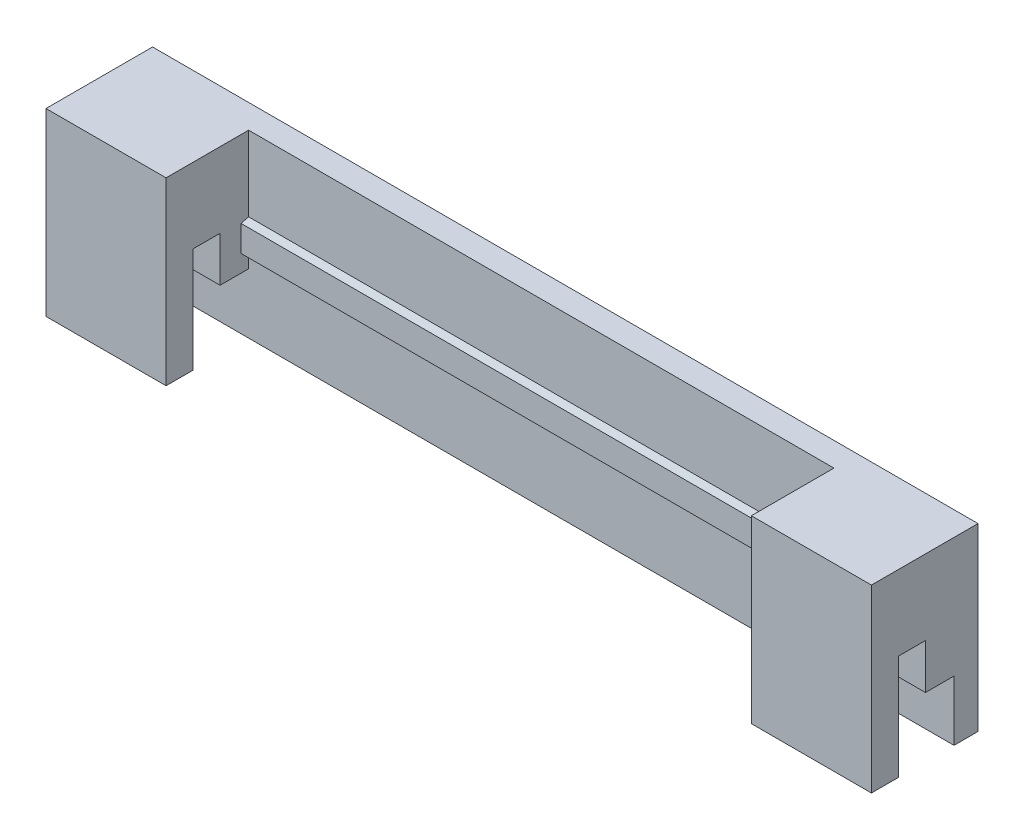
ISO-10303-21;
HEADER;
FILE_DESCRIPTION(('STEP AP214'),'2;1');
FILE_NAME('part.step','',(''),(''),'','','');
FILE_SCHEMA(('AUTOMOTIVE_DESIGN { 1 0 10303 214 1 1 1 1 }'));
ENDSEC;
DATA;
#1=APPLICATION_CONTEXT('core data for automotive mechanical design processes');
#2=APPLICATION_PROTOCOL_DEFINITION('international standard','automotive_design',2000,#1);
#3=PRODUCT_CONTEXT('',#1,'mechanical');
#4=PRODUCT('Part','Part','',(#3));
#5=PRODUCT_RELATED_PRODUCT_CATEGORY('part','',(#4));
#6=PRODUCT_DEFINITION_FORMATION('','',#4);
#7=PRODUCT_DEFINITION_CONTEXT('part definition',#1,'design');
#8=PRODUCT_DEFINITION('design','',#6,#7);
#9=PRODUCT_DEFINITION_SHAPE('','',#8);
#10=(LENGTH_UNIT() NAMED_UNIT(*) SI_UNIT(.MILLI.,.METRE.));
#11=(NAMED_UNIT(*) PLANE_ANGLE_UNIT() SI_UNIT($,.RADIAN.));
#12=(NAMED_UNIT(*) SI_UNIT($,.STERADIAN.) SOLID_ANGLE_UNIT());
#13=UNCERTAINTY_MEASURE_WITH_UNIT(LENGTH_MEASURE(1.E-05),#10,'distance_accuracy_value','');
#14=(GEOMETRIC_REPRESENTATION_CONTEXT(3) GLOBAL_UNCERTAINTY_ASSIGNED_CONTEXT((#13)) GLOBAL_UNIT_ASSIGNED_CONTEXT((#10,
#11,#12)) REPRESENTATION_CONTEXT('',''));
#15=CARTESIAN_POINT('',(0.,0.,0.));
#16=DIRECTION('',(0.,0.,1.));
#17=DIRECTION('',(1.,0.,0.));
#18=AXIS2_PLACEMENT_3D('',#15,#16,#17);
#19=CARTESIAN_POINT('',(0.,0.,1.6));
#20=DIRECTION('',(0.,0.,-1.));
#21=DIRECTION('',(-1.,0.,0.));
#22=AXIS2_PLACEMENT_3D('',#19,#20,#21);
#23=PLANE('',#22);
#24=DIRECTION('',(1.,0.,0.));
#25=VECTOR('',#24,1.);
#26=CARTESIAN_POINT('',(-27.5,-1.,1.6));
#27=LINE('',#26,#25);
#28=CARTESIAN_POINT('',(-19.5,-1.,1.6));
#29=VERTEX_POINT('',#28);
#30=CARTESIAN_POINT('',(19.5,-1.,1.6));
#31=VERTEX_POINT('',#30);
#32=EDGE_CURVE('E208',#29,#31,#27,.T.);
#33=ORIENTED_EDGE('',*,*,#32,.F.);
#34=DIRECTION('',(0.,1.,0.));
#35=VECTOR('',#34,1.);
#36=CARTESIAN_POINT('',(-19.5,6.,1.6));
#37=LINE('',#36,#35);
#38=CARTESIAN_POINT('',(-19.5,-2.,1.6));
#39=VERTEX_POINT('',#38);
#40=EDGE_CURVE('E243',#39,#29,#37,.T.);
#41=ORIENTED_EDGE('',*,*,#40,.F.);
#42=DIRECTION('',(1.,0.,0.));
#43=VECTOR('',#42,1.);
#44=CARTESIAN_POINT('',(-27.5,-2.,1.6));
#45=LINE('',#44,#43);
#46=CARTESIAN_POINT('',(-27.5,-2.,1.6));
#47=VERTEX_POINT('',#46);
#48=EDGE_CURVE('E238',#47,#39,#45,.T.);
#49=ORIENTED_EDGE('',*,*,#48,.F.);
#50=DIRECTION('',(0.,-1.,0.));
#51=VECTOR('',#50,1.);
#52=CARTESIAN_POINT('',(-27.5,6.,1.6));
#53=LINE('',#52,#51);
#54=CARTESIAN_POINT('',(-27.5,-6.00000000000001,1.6));
#55=VERTEX_POINT('',#54);
#56=EDGE_CURVE('E268',#47,#55,#53,.T.);
#57=ORIENTED_EDGE('',*,*,#56,.T.);
#58=DIRECTION('',(1.,0.,0.));
#59=VECTOR('',#58,1.);
#60=CARTESIAN_POINT('',(27.5,-6.,1.6));
#61=LINE('',#60,#59);
#62=CARTESIAN_POINT('',(27.5,-6.,1.6));
#63=VERTEX_POINT('',#62);
#64=EDGE_CURVE('E271',#55,#63,#61,.T.);
#65=ORIENTED_EDGE('',*,*,#64,.T.);
#66=DIRECTION('',(0.,1.,0.));
#67=VECTOR('',#66,1.);
#68=CARTESIAN_POINT('',(27.5,6.,1.6));
#69=LINE('',#68,#67);
#70=CARTESIAN_POINT('',(27.5,-2.,1.6));
#71=VERTEX_POINT('',#70);
#72=EDGE_CURVE('E275',#63,#71,#69,.T.);
#73=ORIENTED_EDGE('',*,*,#72,.T.);
#74=DIRECTION('',(1.,0.,0.));
#75=VECTOR('',#74,1.);
#76=CARTESIAN_POINT('',(27.5,-2.,1.6));
#77=LINE('',#76,#75);
#78=CARTESIAN_POINT('',(19.5,-2.,1.6));
#79=VERTEX_POINT('',#78);
#80=EDGE_CURVE('E215',#79,#71,#77,.T.);
#81=ORIENTED_EDGE('',*,*,#80,.F.);
#82=DIRECTION('',(0.,-1.,0.));
#83=VECTOR('',#82,1.);
#84=CARTESIAN_POINT('',(19.5,6.,1.6));
#85=LINE('',#84,#83);
#86=EDGE_CURVE('E216',#31,#79,#85,.T.);
#87=ORIENTED_EDGE('',*,*,#86,.F.);
#88=EDGE_LOOP('',(#33,#41,#49,#57,#65,#73,#81,#87));
#89=FACE_BOUND('',#88,.T.);
#90=ADVANCED_FACE('F39',(#89),#23,.F.);
#91=DIRECTION('',(-1.,0.,0.));
#92=VECTOR('',#91,1.);
#93=CARTESIAN_POINT('',(-27.5,0.999999999999996,1.6));
#94=LINE('',#93,#92);
#95=CARTESIAN_POINT('',(19.5,0.999999999999996,1.6));
#96=VERTEX_POINT('',#95);
#97=CARTESIAN_POINT('',(-19.5,0.999999999999996,1.6));
#98=VERTEX_POINT('',#97);
#99=EDGE_CURVE('E190',#96,#98,#94,.T.);
#100=ORIENTED_EDGE('',*,*,#99,.F.);
#101=CARTESIAN_POINT('',(19.5,6.,1.6));
#102=VERTEX_POINT('',#101);
#103=EDGE_CURVE('E204',#102,#96,#85,.T.);
#104=ORIENTED_EDGE('',*,*,#103,.F.);
#105=DIRECTION('',(-1.,0.,0.));
#106=VECTOR('',#105,1.);
#107=CARTESIAN_POINT('',(27.5,6.,1.6));
#108=LINE('',#107,#106);
#109=CARTESIAN_POINT('',(-19.5,6.,1.6));
#110=VERTEX_POINT('',#109);
#111=EDGE_CURVE('E278',#102,#110,#108,.T.);
#112=ORIENTED_EDGE('',*,*,#111,.T.);
#113=EDGE_CURVE('E206',#98,#110,#37,.T.);
#114=ORIENTED_EDGE('',*,*,#113,.F.);
#115=EDGE_LOOP('',(#100,#104,#112,#114));
#116=FACE_BOUND('',#115,.T.);
#117=ADVANCED_FACE('F202',(#116),#23,.F.);
#118=CARTESIAN_POINT('',(-19.5,6.,3.5));
#119=DIRECTION('',(-1.,0.,0.));
#120=DIRECTION('',(0.,0.,1.));
#121=AXIS2_PLACEMENT_3D('',#118,#119,#120);
#122=PLANE('',#121);
#123=DIRECTION('',(0.,0.258819045102521,0.965925826289068));
#124=VECTOR('',#123,1.);
#125=CARTESIAN_POINT('',(-19.5,-0.0560889132455358,5.12272413359522));
#126=LINE('',#125,#124);
#127=CARTESIAN_POINT('',(-19.5,-0.866025403784443,2.1));
#128=VERTEX_POINT('',#127);
#129=EDGE_CURVE('E319',#128,#29,#126,.F.);
#130=ORIENTED_EDGE('',*,*,#129,.F.);
#131=DIRECTION('',(0.,1.,0.));
#132=VECTOR('',#131,1.);
#133=CARTESIAN_POINT('',(-19.5,6.,2.1));
#134=LINE('',#133,#132);
#135=CARTESIAN_POINT('',(-19.5,0.866025403784434,2.1));
#136=VERTEX_POINT('',#135);
#137=EDGE_CURVE('E312',#128,#136,#134,.T.);
#138=ORIENTED_EDGE('',*,*,#137,.T.);
#139=DIRECTION('',(0.,0.258819045102521,-0.965925826289068));
#140=VECTOR('',#139,1.);
#141=CARTESIAN_POINT('',(-19.5,0.8599364905389,2.12272413359521));
#142=LINE('',#141,#140);
#143=EDGE_CURVE('E318',#98,#136,#142,.F.);
#144=ORIENTED_EDGE('',*,*,#143,.F.);
#145=ORIENTED_EDGE('',*,*,#113,.T.);
#146=DIRECTION('',(0.,0.,-1.));
#147=VECTOR('',#146,1.);
#148=CARTESIAN_POINT('',(-19.5,6.,3.5));
#149=LINE('',#148,#147);
#150=CARTESIAN_POINT('',(-19.5,6.,7.1));
#151=VERTEX_POINT('',#150);
#152=EDGE_CURVE('E249',#151,#110,#149,.T.);
#153=ORIENTED_EDGE('',*,*,#152,.F.);
#154=DIRECTION('',(0.,1.,0.));
#155=VECTOR('',#154,1.);
#156=CARTESIAN_POINT('',(-19.5,6.,7.1));
#157=LINE('',#156,#155);
#158=CARTESIAN_POINT('',(-19.5,-6.00000000000001,7.1));
#159=VERTEX_POINT('',#158);
#160=EDGE_CURVE('E369',#159,#151,#157,.T.);
#161=ORIENTED_EDGE('',*,*,#160,.F.);
#162=DIRECTION('',(0.,0.,-1.));
#163=VECTOR('',#162,1.);
#164=CARTESIAN_POINT('',(-19.5,-6.00000000000001,7.1));
#165=LINE('',#164,#163);
#166=CARTESIAN_POINT('',(-19.5,-6.00000000000001,5.3));
#167=VERTEX_POINT('',#166);
#168=EDGE_CURVE('E377',#159,#167,#165,.T.);
#169=ORIENTED_EDGE('',*,*,#168,.T.);
#170=DIRECTION('',(0.,1.,0.));
#171=VECTOR('',#170,1.);
#172=CARTESIAN_POINT('',(-19.5,6.,5.3));
#173=LINE('',#172,#171);
#174=CARTESIAN_POINT('',(-19.5,0.999999999999997,5.3));
#175=VERTEX_POINT('',#174);
#176=EDGE_CURVE('E366',#167,#175,#173,.T.);
#177=ORIENTED_EDGE('',*,*,#176,.T.);
#178=DIRECTION('',(0.,0.,-1.));
#179=VECTOR('',#178,1.);
#180=CARTESIAN_POINT('',(-19.5,0.999999999999997,5.3));
#181=LINE('',#180,#179);
#182=CARTESIAN_POINT('',(-19.5,0.999999999999997,3.5));
#183=VERTEX_POINT('',#182);
#184=EDGE_CURVE('E412',#175,#183,#181,.T.);
#185=ORIENTED_EDGE('',*,*,#184,.T.);
#186=DIRECTION('',(0.,1.,0.));
#187=VECTOR('',#186,1.);
#188=CARTESIAN_POINT('',(-19.5,6.,3.5));
#189=LINE('',#188,#187);
#190=CARTESIAN_POINT('',(-19.5,-2.,3.5));
#191=VERTEX_POINT('',#190);
#192=EDGE_CURVE('E246',#191,#183,#189,.T.);
#193=ORIENTED_EDGE('',*,*,#192,.F.);
#194=DIRECTION('',(0.,0.,-1.));
#195=VECTOR('',#194,1.);
#196=CARTESIAN_POINT('',(-19.5,-2.,3.5));
#197=LINE('',#196,#195);
#198=EDGE_CURVE('E259',#191,#39,#197,.T.);
#199=ORIENTED_EDGE('',*,*,#198,.T.);
#200=ORIENTED_EDGE('',*,*,#40,.T.);
#201=EDGE_LOOP('',(#130,#138,#144,#145,#153,#161,#169,#177,#185,#193,#199,#200));
#202=FACE_BOUND('',#201,.T.);
#203=ADVANCED_FACE('F317',(#202),#122,.F.);
#204=CARTESIAN_POINT('',(19.5,6.,3.5));
#205=DIRECTION('',(1.,0.,0.));
#206=DIRECTION('',(0.,0.,-1.));
#207=AXIS2_PLACEMENT_3D('',#204,#205,#206);
#208=PLANE('',#207);
#209=DIRECTION('',(0.,-0.258819045102521,-0.965925826289068));
#210=VECTOR('',#209,1.);
#211=CARTESIAN_POINT('',(19.5,-0.0560889132455358,5.12272413359522));
#212=LINE('',#211,#210);
#213=CARTESIAN_POINT('',(19.5,-0.866025403784443,2.1));
#214=VERTEX_POINT('',#213);
#215=EDGE_CURVE('E11',#31,#214,#212,.F.);
#216=ORIENTED_EDGE('',*,*,#215,.F.);
#217=ORIENTED_EDGE('',*,*,#86,.T.);
#218=DIRECTION('',(0.,0.,-1.));
#219=VECTOR('',#218,1.);
#220=CARTESIAN_POINT('',(19.5,-2.,3.5));
#221=LINE('',#220,#219);
#222=CARTESIAN_POINT('',(19.5,-2.,3.5));
#223=VERTEX_POINT('',#222);
#224=EDGE_CURVE('E232',#223,#79,#221,.T.);
#225=ORIENTED_EDGE('',*,*,#224,.F.);
#226=DIRECTION('',(0.,-1.,0.));
#227=VECTOR('',#226,1.);
#228=CARTESIAN_POINT('',(19.5,6.,3.5));
#229=LINE('',#228,#227);
#230=CARTESIAN_POINT('',(19.5,0.999999999999997,3.5));
#231=VERTEX_POINT('',#230);
#232=EDGE_CURVE('E423',#231,#223,#229,.T.);
#233=ORIENTED_EDGE('',*,*,#232,.F.);
#234=DIRECTION('',(0.,0.,-1.));
#235=VECTOR('',#234,1.);
#236=CARTESIAN_POINT('',(19.5,0.999999999999997,5.3));
#237=LINE('',#236,#235);
#238=CARTESIAN_POINT('',(19.5,0.999999999999998,5.3));
#239=VERTEX_POINT('',#238);
#240=EDGE_CURVE('E403',#239,#231,#237,.T.);
#241=ORIENTED_EDGE('',*,*,#240,.F.);
#242=DIRECTION('',(0.,-1.,0.));
#243=VECTOR('',#242,1.);
#244=CARTESIAN_POINT('',(19.5,6.,5.3));
#245=LINE('',#244,#243);
#246=CARTESIAN_POINT('',(19.5,-6.00000000000001,5.3));
#247=VERTEX_POINT('',#246);
#248=EDGE_CURVE('E348',#239,#247,#245,.T.);
#249=ORIENTED_EDGE('',*,*,#248,.T.);
#250=DIRECTION('',(0.,0.,-1.));
#251=VECTOR('',#250,1.);
#252=CARTESIAN_POINT('',(19.5,-6.00000000000001,7.1));
#253=LINE('',#252,#251);
#254=CARTESIAN_POINT('',(19.5,-6.00000000000001,7.1));
#255=VERTEX_POINT('',#254);
#256=EDGE_CURVE('E356',#255,#247,#253,.T.);
#257=ORIENTED_EDGE('',*,*,#256,.F.);
#258=DIRECTION('',(0.,-1.,0.));
#259=VECTOR('',#258,1.);
#260=CARTESIAN_POINT('',(19.5,6.,7.1));
#261=LINE('',#260,#259);
#262=CARTESIAN_POINT('',(19.5,6.,7.1));
#263=VERTEX_POINT('',#262);
#264=EDGE_CURVE('E338',#263,#255,#261,.T.);
#265=ORIENTED_EDGE('',*,*,#264,.F.);
#266=DIRECTION('',(0.,0.,-1.));
#267=VECTOR('',#266,1.);
#268=CARTESIAN_POINT('',(19.5,6.,3.5));
#269=LINE('',#268,#267);
#270=EDGE_CURVE('E213',#263,#102,#269,.T.);
#271=ORIENTED_EDGE('',*,*,#270,.T.);
#272=ORIENTED_EDGE('',*,*,#103,.T.);
#273=DIRECTION('',(0.,-0.258819045102521,0.965925826289068));
#274=VECTOR('',#273,1.);
#275=CARTESIAN_POINT('',(19.5,0.8599364905389,2.12272413359521));
#276=LINE('',#275,#274);
#277=CARTESIAN_POINT('',(19.5,0.866025403784434,2.1));
#278=VERTEX_POINT('',#277);
#279=EDGE_CURVE('E48',#278,#96,#276,.F.);
#280=ORIENTED_EDGE('',*,*,#279,.F.);
#281=DIRECTION('',(0.,-1.,0.));
#282=VECTOR('',#281,1.);
#283=CARTESIAN_POINT('',(19.5,6.,2.1));
#284=LINE('',#283,#282);
#285=EDGE_CURVE('E198',#278,#214,#284,.T.);
#286=ORIENTED_EDGE('',*,*,#285,.T.);
#287=EDGE_LOOP('',(#216,#217,#225,#233,#241,#249,#257,#265,#271,#272,#280,#286));
#288=FACE_BOUND('',#287,.T.);
#289=ADVANCED_FACE('F211',(#288),#208,.F.);
#290=CARTESIAN_POINT('',(0.,0.,3.5));
#291=DIRECTION('',(0.,0.,-1.));
#292=DIRECTION('',(-1.,0.,0.));
#293=AXIS2_PLACEMENT_3D('',#290,#291,#292);
#294=PLANE('',#293);
#295=DIRECTION('',(1.,0.,0.));
#296=VECTOR('',#295,1.);
#297=CARTESIAN_POINT('',(19.5,0.999999999999997,3.5));
#298=LINE('',#297,#296);
#299=CARTESIAN_POINT('',(27.5,0.999999999999997,3.5));
#300=VERTEX_POINT('',#299);
#301=EDGE_CURVE('E62',#231,#300,#298,.T.);
#302=ORIENTED_EDGE('',*,*,#301,.F.);
#303=ORIENTED_EDGE('',*,*,#232,.T.);
#304=DIRECTION('',(1.,0.,0.));
#305=VECTOR('',#304,1.);
#306=CARTESIAN_POINT('',(27.5,-2.,3.5));
#307=LINE('',#306,#305);
#308=CARTESIAN_POINT('',(27.5,-2.,3.5));
#309=VERTEX_POINT('',#308);
#310=EDGE_CURVE('E225',#223,#309,#307,.T.);
#311=ORIENTED_EDGE('',*,*,#310,.T.);
#312=DIRECTION('',(0.,1.,0.));
#313=VECTOR('',#312,1.);
#314=CARTESIAN_POINT('',(27.5,6.,3.5));
#315=LINE('',#314,#313);
#316=EDGE_CURVE('E221',#309,#300,#315,.T.);
#317=ORIENTED_EDGE('',*,*,#316,.T.);
#318=EDGE_LOOP('',(#302,#303,#311,#317));
#319=FACE_BOUND('',#318,.T.);
#320=ADVANCED_FACE('F429',(#319),#294,.F.);
#321=CARTESIAN_POINT('',(0.,0.,3.5));
#322=DIRECTION('',(0.,0.,1.));
#323=DIRECTION('',(1.,0.,0.));
#324=AXIS2_PLACEMENT_3D('',#321,#322,#323);
#325=PLANE('',#324);
#326=ORIENTED_EDGE('',*,*,#192,.T.);
#327=DIRECTION('',(1.,0.,0.));
#328=VECTOR('',#327,1.);
#329=CARTESIAN_POINT('',(-27.5,0.999999999999996,3.5));
#330=LINE('',#329,#328);
#331=CARTESIAN_POINT('',(-27.5,0.999999999999997,3.5));
#332=VERTEX_POINT('',#331);
#333=EDGE_CURVE('E407',#332,#183,#330,.T.);
#334=ORIENTED_EDGE('',*,*,#333,.F.);
#335=DIRECTION('',(0.,-1.,0.));
#336=VECTOR('',#335,1.);
#337=CARTESIAN_POINT('',(-27.5,6.,3.5));
#338=LINE('',#337,#336);
#339=CARTESIAN_POINT('',(-27.5,-2.,3.5));
#340=VERTEX_POINT('',#339);
#341=EDGE_CURVE('E239',#332,#340,#338,.T.);
#342=ORIENTED_EDGE('',*,*,#341,.T.);
#343=DIRECTION('',(1.,0.,0.));
#344=VECTOR('',#343,1.);
#345=CARTESIAN_POINT('',(-27.5,-2.,3.5));
#346=LINE('',#345,#344);
#347=EDGE_CURVE('E242',#340,#191,#346,.T.);
#348=ORIENTED_EDGE('',*,*,#347,.T.);
#349=EDGE_LOOP('',(#326,#334,#342,#348));
#350=FACE_BOUND('',#349,.T.);
#351=ADVANCED_FACE('F480',(#350),#325,.T.);
#352=CARTESIAN_POINT('',(-27.5,6.,1.6));
#353=DIRECTION('',(1.,0.,0.));
#354=DIRECTION('',(0.,1.,0.));
#355=AXIS2_PLACEMENT_3D('',#352,#353,#354);
#356=PLANE('',#355);
#357=DIRECTION('',(0.,-1.,0.));
#358=VECTOR('',#357,1.);
#359=CARTESIAN_POINT('',(-27.5,6.,0.));
#360=LINE('',#359,#358);
#361=CARTESIAN_POINT('',(-27.5,6.,0.));
#362=VERTEX_POINT('',#361);
#363=CARTESIAN_POINT('',(-27.5,-6.00000000000001,0.));
#364=VERTEX_POINT('',#363);
#365=EDGE_CURVE('E267',#362,#364,#360,.T.);
#366=ORIENTED_EDGE('',*,*,#365,.T.);
#367=DIRECTION('',(0.,0.,-1.));
#368=VECTOR('',#367,1.);
#369=CARTESIAN_POINT('',(-27.5,-6.00000000000001,1.6));
#370=LINE('',#369,#368);
#371=EDGE_CURVE('E304',#55,#364,#370,.T.);
#372=ORIENTED_EDGE('',*,*,#371,.F.);
#373=ORIENTED_EDGE('',*,*,#56,.F.);
#374=DIRECTION('',(0.,0.,-1.));
#375=VECTOR('',#374,1.);
#376=CARTESIAN_POINT('',(-27.5,-2.,3.5));
#377=LINE('',#376,#375);
#378=EDGE_CURVE('E263',#340,#47,#377,.T.);
#379=ORIENTED_EDGE('',*,*,#378,.F.);
#380=ORIENTED_EDGE('',*,*,#341,.F.);
#381=DIRECTION('',(0.,0.,-1.));
#382=VECTOR('',#381,1.);
#383=CARTESIAN_POINT('',(-27.5,0.999999999999996,5.3));
#384=LINE('',#383,#382);
#385=CARTESIAN_POINT('',(-27.5,0.999999999999996,5.3));
#386=VERTEX_POINT('',#385);
#387=EDGE_CURVE('E223',#386,#332,#384,.T.);
#388=ORIENTED_EDGE('',*,*,#387,.F.);
#389=DIRECTION('',(0.,-1.,0.));
#390=VECTOR('',#389,1.);
#391=CARTESIAN_POINT('',(-27.5,6.,5.3));
#392=LINE('',#391,#390);
#393=CARTESIAN_POINT('',(-27.5,-6.00000000000001,5.3));
#394=VERTEX_POINT('',#393);
#395=EDGE_CURVE('E360',#386,#394,#392,.T.);
#396=ORIENTED_EDGE('',*,*,#395,.T.);
#397=DIRECTION('',(0.,0.,-1.));
#398=VECTOR('',#397,1.);
#399=CARTESIAN_POINT('',(-27.5,-6.00000000000001,7.1));
#400=LINE('',#399,#398);
#401=CARTESIAN_POINT('',(-27.5,-6.00000000000001,7.1));
#402=VERTEX_POINT('',#401);
#403=EDGE_CURVE('E389',#402,#394,#400,.T.);
#404=ORIENTED_EDGE('',*,*,#403,.F.);
#405=DIRECTION('',(0.,-1.,0.));
#406=VECTOR('',#405,1.);
#407=CARTESIAN_POINT('',(-27.5,6.,7.1));
#408=LINE('',#407,#406);
#409=CARTESIAN_POINT('',(-27.5,6.,7.1));
#410=VERTEX_POINT('',#409);
#411=EDGE_CURVE('E361',#410,#402,#408,.T.);
#412=ORIENTED_EDGE('',*,*,#411,.F.);
#413=DIRECTION('',(0.,0.,-1.));
#414=VECTOR('',#413,1.);
#415=CARTESIAN_POINT('',(-27.5,6.,1.6));
#416=LINE('',#415,#414);
#417=EDGE_CURVE('E281',#410,#362,#416,.T.);
#418=ORIENTED_EDGE('',*,*,#417,.T.);
#419=EDGE_LOOP('',(#366,#372,#373,#379,#380,#388,#396,#404,#412,#418));
#420=FACE_BOUND('',#419,.T.);
#421=ADVANCED_FACE('F41',(#420),#356,.F.);
#422=CARTESIAN_POINT('',(27.5,-6.,1.6));
#423=DIRECTION('',(0.,1.,0.));
#424=DIRECTION('',(-1.,0.,0.));
#425=AXIS2_PLACEMENT_3D('',#422,#423,#424);
#426=PLANE('',#425);
#427=DIRECTION('',(1.,0.,0.));
#428=VECTOR('',#427,1.);
#429=CARTESIAN_POINT('',(27.5,-6.,0.));
#430=LINE('',#429,#428);
#431=CARTESIAN_POINT('',(27.5,-6.,0.));
#432=VERTEX_POINT('',#431);
#433=EDGE_CURVE('E285',#364,#432,#430,.T.);
#434=ORIENTED_EDGE('',*,*,#433,.T.);
#435=DIRECTION('',(0.,0.,-1.));
#436=VECTOR('',#435,1.);
#437=CARTESIAN_POINT('',(27.5,-6.,1.6));
#438=LINE('',#437,#436);
#439=EDGE_CURVE('E300',#63,#432,#438,.T.);
#440=ORIENTED_EDGE('',*,*,#439,.F.);
#441=ORIENTED_EDGE('',*,*,#64,.F.);
#442=ORIENTED_EDGE('',*,*,#371,.T.);
#443=EDGE_LOOP('',(#434,#440,#441,#442));
#444=FACE_BOUND('',#443,.T.);
#445=ADVANCED_FACE('F515',(#444),#426,.F.);
#446=CARTESIAN_POINT('',(27.5,6.,1.6));
#447=DIRECTION('',(-1.,0.,0.));
#448=DIRECTION('',(0.,0.,1.));
#449=AXIS2_PLACEMENT_3D('',#446,#447,#448);
#450=PLANE('',#449);
#451=DIRECTION('',(0.,1.,0.));
#452=VECTOR('',#451,1.);
#453=CARTESIAN_POINT('',(27.5,6.,0.));
#454=LINE('',#453,#452);
#455=CARTESIAN_POINT('',(27.5,6.,0.));
#456=VERTEX_POINT('',#455);
#457=EDGE_CURVE('E288',#432,#456,#454,.T.);
#458=ORIENTED_EDGE('',*,*,#457,.T.);
#459=DIRECTION('',(0.,0.,-1.));
#460=VECTOR('',#459,1.);
#461=CARTESIAN_POINT('',(27.5,6.,1.6));
#462=LINE('',#461,#460);
#463=CARTESIAN_POINT('',(27.5,6.,7.1));
#464=VERTEX_POINT('',#463);
#465=EDGE_CURVE('E296',#464,#456,#462,.T.);
#466=ORIENTED_EDGE('',*,*,#465,.F.);
#467=DIRECTION('',(0.,1.,0.));
#468=VECTOR('',#467,1.);
#469=CARTESIAN_POINT('',(27.5,6.,7.1));
#470=LINE('',#469,#468);
#471=CARTESIAN_POINT('',(27.5,-6.,7.1));
#472=VERTEX_POINT('',#471);
#473=EDGE_CURVE('E329',#472,#464,#470,.T.);
#474=ORIENTED_EDGE('',*,*,#473,.F.);
#475=DIRECTION('',(0.,0.,-1.));
#476=VECTOR('',#475,1.);
#477=CARTESIAN_POINT('',(27.5,-6.,7.1));
#478=LINE('',#477,#476);
#479=CARTESIAN_POINT('',(27.5,-6.,5.3));
#480=VERTEX_POINT('',#479);
#481=EDGE_CURVE('E344',#472,#480,#478,.T.);
#482=ORIENTED_EDGE('',*,*,#481,.T.);
#483=DIRECTION('',(0.,1.,0.));
#484=VECTOR('',#483,1.);
#485=CARTESIAN_POINT('',(27.5,6.,5.3));
#486=LINE('',#485,#484);
#487=CARTESIAN_POINT('',(27.5,0.999999999999997,5.3));
#488=VERTEX_POINT('',#487);
#489=EDGE_CURVE('E328',#480,#488,#486,.T.);
#490=ORIENTED_EDGE('',*,*,#489,.T.);
#491=DIRECTION('',(0.,0.,-1.));
#492=VECTOR('',#491,1.);
#493=CARTESIAN_POINT('',(27.5,0.999999999999997,5.3));
#494=LINE('',#493,#492);
#495=EDGE_CURVE('E397',#488,#300,#494,.T.);
#496=ORIENTED_EDGE('',*,*,#495,.T.);
#497=ORIENTED_EDGE('',*,*,#316,.F.);
#498=DIRECTION('',(0.,0.,-1.));
#499=VECTOR('',#498,1.);
#500=CARTESIAN_POINT('',(27.5,-2.,3.5));
#501=LINE('',#500,#499);
#502=EDGE_CURVE('E228',#309,#71,#501,.T.);
#503=ORIENTED_EDGE('',*,*,#502,.T.);
#504=ORIENTED_EDGE('',*,*,#72,.F.);
#505=ORIENTED_EDGE('',*,*,#439,.T.);
#506=EDGE_LOOP('',(#458,#466,#474,#482,#490,#496,#497,#503,#504,#505));
#507=FACE_BOUND('',#506,.T.);
#508=ADVANCED_FACE('F436',(#507),#450,.F.);
#509=CARTESIAN_POINT('',(27.5,6.,1.6));
#510=DIRECTION('',(0.,-1.,0.));
#511=DIRECTION('',(1.,0.,0.));
#512=AXIS2_PLACEMENT_3D('',#509,#510,#511);
#513=PLANE('',#512);
#514=DIRECTION('',(-1.,0.,0.));
#515=VECTOR('',#514,1.);
#516=CARTESIAN_POINT('',(27.5,6.,0.));
#517=LINE('',#516,#515);
#518=EDGE_CURVE('E272',#456,#362,#517,.T.);
#519=ORIENTED_EDGE('',*,*,#518,.T.);
#520=ORIENTED_EDGE('',*,*,#417,.F.);
#521=DIRECTION('',(-1.,0.,0.));
#522=VECTOR('',#521,1.);
#523=CARTESIAN_POINT('',(-27.5,6.,7.1));
#524=LINE('',#523,#522);
#525=EDGE_CURVE('E373',#151,#410,#524,.T.);
#526=ORIENTED_EDGE('',*,*,#525,.F.);
#527=ORIENTED_EDGE('',*,*,#152,.T.);
#528=ORIENTED_EDGE('',*,*,#111,.F.);
#529=ORIENTED_EDGE('',*,*,#270,.F.);
#530=DIRECTION('',(-1.,0.,0.));
#531=VECTOR('',#530,1.);
#532=CARTESIAN_POINT('',(27.5,6.,7.1));
#533=LINE('',#532,#531);
#534=EDGE_CURVE('E333',#464,#263,#533,.T.);
#535=ORIENTED_EDGE('',*,*,#534,.F.);
#536=ORIENTED_EDGE('',*,*,#465,.T.);
#537=EDGE_LOOP('',(#519,#520,#526,#527,#528,#529,#535,#536));
#538=FACE_BOUND('',#537,.T.);
#539=ADVANCED_FACE('F455',(#538),#513,.F.);
#540=CARTESIAN_POINT('',(0.,0.,0.));
#541=DIRECTION('',(0.,0.,-1.));
#542=DIRECTION('',(-1.,0.,0.));
#543=AXIS2_PLACEMENT_3D('',#540,#541,#542);
#544=PLANE('',#543);
#545=ORIENTED_EDGE('',*,*,#365,.F.);
#546=ORIENTED_EDGE('',*,*,#518,.F.);
#547=ORIENTED_EDGE('',*,*,#457,.F.);
#548=ORIENTED_EDGE('',*,*,#433,.F.);
#549=EDGE_LOOP('',(#545,#546,#547,#548));
#550=FACE_BOUND('',#549,.T.);
#551=ADVANCED_FACE('F508',(#550),#544,.T.);
#552=CARTESIAN_POINT('',(-27.5,-2.,3.5));
#553=DIRECTION('',(0.,1.,0.));
#554=DIRECTION('',(0.,0.,1.));
#555=AXIS2_PLACEMENT_3D('',#552,#553,#554);
#556=PLANE('',#555);
#557=ORIENTED_EDGE('',*,*,#48,.T.);
#558=ORIENTED_EDGE('',*,*,#198,.F.);
#559=ORIENTED_EDGE('',*,*,#347,.F.);
#560=ORIENTED_EDGE('',*,*,#378,.T.);
#561=EDGE_LOOP('',(#557,#558,#559,#560));
#562=FACE_BOUND('',#561,.T.);
#563=ADVANCED_FACE('F483',(#562),#556,.F.);
#564=CARTESIAN_POINT('',(27.5,-2.,3.5));
#565=DIRECTION('',(0.,1.,0.));
#566=DIRECTION('',(-1.,0.,0.));
#567=AXIS2_PLACEMENT_3D('',#564,#565,#566);
#568=PLANE('',#567);
#569=ORIENTED_EDGE('',*,*,#80,.T.);
#570=ORIENTED_EDGE('',*,*,#502,.F.);
#571=ORIENTED_EDGE('',*,*,#310,.F.);
#572=ORIENTED_EDGE('',*,*,#224,.T.);
#573=EDGE_LOOP('',(#569,#570,#571,#572));
#574=FACE_BOUND('',#573,.T.);
#575=ADVANCED_FACE('F432',(#574),#568,.F.);
#576=CARTESIAN_POINT('',(-27.5,0.999999999999996,5.3));
#577=DIRECTION('',(0.,1.,0.));
#578=DIRECTION('',(-1.,0.,0.));
#579=AXIS2_PLACEMENT_3D('',#576,#577,#578);
#580=PLANE('',#579);
#581=ORIENTED_EDGE('',*,*,#333,.T.);
#582=ORIENTED_EDGE('',*,*,#184,.F.);
#583=DIRECTION('',(1.,0.,0.));
#584=VECTOR('',#583,1.);
#585=CARTESIAN_POINT('',(-27.5,0.999999999999996,5.3));
#586=LINE('',#585,#584);
#587=EDGE_CURVE('E408',#386,#175,#586,.T.);
#588=ORIENTED_EDGE('',*,*,#587,.F.);
#589=ORIENTED_EDGE('',*,*,#387,.T.);
#590=EDGE_LOOP('',(#581,#582,#588,#589));
#591=FACE_BOUND('',#590,.T.);
#592=ADVANCED_FACE('F473',(#591),#580,.F.);
#593=CARTESIAN_POINT('',(19.5,0.999999999999997,5.3));
#594=DIRECTION('',(0.,1.,0.));
#595=DIRECTION('',(0.,0.,1.));
#596=AXIS2_PLACEMENT_3D('',#593,#594,#595);
#597=PLANE('',#596);
#598=ORIENTED_EDGE('',*,*,#301,.T.);
#599=ORIENTED_EDGE('',*,*,#495,.F.);
#600=DIRECTION('',(1.,0.,0.));
#601=VECTOR('',#600,1.);
#602=CARTESIAN_POINT('',(19.5,0.999999999999997,5.3));
#603=LINE('',#602,#601);
#604=EDGE_CURVE('E393',#239,#488,#603,.T.);
#605=ORIENTED_EDGE('',*,*,#604,.F.);
#606=ORIENTED_EDGE('',*,*,#240,.T.);
#607=EDGE_LOOP('',(#598,#599,#605,#606));
#608=FACE_BOUND('',#607,.T.);
#609=ADVANCED_FACE('F440',(#608),#597,.F.);
#610=CARTESIAN_POINT('',(0.,0.,5.3));
#611=DIRECTION('',(0.,0.,1.));
#612=DIRECTION('',(1.,0.,0.));
#613=AXIS2_PLACEMENT_3D('',#610,#611,#612);
#614=PLANE('',#613);
#615=ORIENTED_EDGE('',*,*,#395,.F.);
#616=ORIENTED_EDGE('',*,*,#587,.T.);
#617=ORIENTED_EDGE('',*,*,#176,.F.);
#618=DIRECTION('',(1.,0.,0.));
#619=VECTOR('',#618,1.);
#620=CARTESIAN_POINT('',(-27.5,-6.00000000000001,5.3));
#621=LINE('',#620,#619);
#622=EDGE_CURVE('E380',#394,#167,#621,.T.);
#623=ORIENTED_EDGE('',*,*,#622,.F.);
#624=EDGE_LOOP('',(#615,#616,#617,#623));
#625=FACE_BOUND('',#624,.T.);
#626=ADVANCED_FACE('F470',(#625),#614,.F.);
#627=CARTESIAN_POINT('',(-27.5,-6.00000000000001,7.1));
#628=DIRECTION('',(0.,1.,0.));
#629=DIRECTION('',(0.,0.,1.));
#630=AXIS2_PLACEMENT_3D('',#627,#628,#629);
#631=PLANE('',#630);
#632=ORIENTED_EDGE('',*,*,#622,.T.);
#633=ORIENTED_EDGE('',*,*,#168,.F.);
#634=DIRECTION('',(1.,0.,0.));
#635=VECTOR('',#634,1.);
#636=CARTESIAN_POINT('',(-27.5,-6.00000000000001,7.1));
#637=LINE('',#636,#635);
#638=EDGE_CURVE('E365',#402,#159,#637,.T.);
#639=ORIENTED_EDGE('',*,*,#638,.F.);
#640=ORIENTED_EDGE('',*,*,#403,.T.);
#641=EDGE_LOOP('',(#632,#633,#639,#640));
#642=FACE_BOUND('',#641,.T.);
#643=ADVANCED_FACE('F465',(#642),#631,.F.);
#644=CARTESIAN_POINT('',(0.,0.,7.1));
#645=DIRECTION('',(0.,0.,1.));
#646=DIRECTION('',(1.,0.,0.));
#647=AXIS2_PLACEMENT_3D('',#644,#645,#646);
#648=PLANE('',#647);
#649=ORIENTED_EDGE('',*,*,#411,.T.);
#650=ORIENTED_EDGE('',*,*,#638,.T.);
#651=ORIENTED_EDGE('',*,*,#160,.T.);
#652=ORIENTED_EDGE('',*,*,#525,.T.);
#653=EDGE_LOOP('',(#649,#650,#651,#652));
#654=FACE_BOUND('',#653,.T.);
#655=ADVANCED_FACE('F460',(#654),#648,.T.);
#656=CARTESIAN_POINT('',(0.,0.,5.3));
#657=DIRECTION('',(0.,0.,-1.));
#658=DIRECTION('',(-1.,0.,0.));
#659=AXIS2_PLACEMENT_3D('',#656,#657,#658);
#660=PLANE('',#659);
#661=ORIENTED_EDGE('',*,*,#604,.T.);
#662=ORIENTED_EDGE('',*,*,#489,.F.);
#663=DIRECTION('',(1.,0.,0.));
#664=VECTOR('',#663,1.);
#665=CARTESIAN_POINT('',(27.5,-6.,5.3));
#666=LINE('',#665,#664);
#667=EDGE_CURVE('E334',#247,#480,#666,.T.);
#668=ORIENTED_EDGE('',*,*,#667,.F.);
#669=ORIENTED_EDGE('',*,*,#248,.F.);
#670=EDGE_LOOP('',(#661,#662,#668,#669));
#671=FACE_BOUND('',#670,.T.);
#672=ADVANCED_FACE('F443',(#671),#660,.T.);
#673=CARTESIAN_POINT('',(27.5,-6.,7.1));
#674=DIRECTION('',(0.,1.,0.));
#675=DIRECTION('',(-1.,0.,0.));
#676=AXIS2_PLACEMENT_3D('',#673,#674,#675);
#677=PLANE('',#676);
#678=ORIENTED_EDGE('',*,*,#667,.T.);
#679=ORIENTED_EDGE('',*,*,#481,.F.);
#680=DIRECTION('',(1.,0.,0.));
#681=VECTOR('',#680,1.);
#682=CARTESIAN_POINT('',(27.5,-6.,7.1));
#683=LINE('',#682,#681);
#684=EDGE_CURVE('E341',#255,#472,#683,.T.);
#685=ORIENTED_EDGE('',*,*,#684,.F.);
#686=ORIENTED_EDGE('',*,*,#256,.T.);
#687=EDGE_LOOP('',(#678,#679,#685,#686));
#688=FACE_BOUND('',#687,.T.);
#689=ADVANCED_FACE('F448',(#688),#677,.F.);
#690=CARTESIAN_POINT('',(0.,0.,7.1));
#691=DIRECTION('',(0.,0.,-1.));
#692=DIRECTION('',(-1.,0.,0.));
#693=AXIS2_PLACEMENT_3D('',#690,#691,#692);
#694=PLANE('',#693);
#695=ORIENTED_EDGE('',*,*,#473,.T.);
#696=ORIENTED_EDGE('',*,*,#534,.T.);
#697=ORIENTED_EDGE('',*,*,#264,.T.);
#698=ORIENTED_EDGE('',*,*,#684,.T.);
#699=EDGE_LOOP('',(#695,#696,#697,#698));
#700=FACE_BOUND('',#699,.T.);
#701=ADVANCED_FACE('F452',(#700),#694,.F.);
#702=CARTESIAN_POINT('',(-27.5,-1.,1.6));
#703=DIRECTION('',(0.,-0.965925826289068,0.258819045102521));
#704=DIRECTION('',(0.,-0.258819045102521,-0.965925826289068));
#705=AXIS2_PLACEMENT_3D('',#702,#703,#704);
#706=PLANE('',#705);
#707=DIRECTION('',(-1.,0.,0.));
#708=VECTOR('',#707,1.);
#709=CARTESIAN_POINT('',(-27.5,-0.866025403784443,2.1));
#710=LINE('',#709,#708);
#711=EDGE_CURVE('E55',#128,#214,#710,.F.);
#712=ORIENTED_EDGE('',*,*,#711,.F.);
#713=ORIENTED_EDGE('',*,*,#129,.T.);
#714=ORIENTED_EDGE('',*,*,#32,.T.);
#715=ORIENTED_EDGE('',*,*,#215,.T.);
#716=EDGE_LOOP('',(#712,#713,#714,#715));
#717=FACE_BOUND('',#716,.T.);
#718=ADVANCED_FACE('F491',(#717),#706,.T.);
#719=CARTESIAN_POINT('',(-27.5,0.999999999999996,1.6));
#720=DIRECTION('',(0.,0.965925826289068,0.258819045102521));
#721=DIRECTION('',(0.,-0.258819045102521,0.965925826289068));
#722=AXIS2_PLACEMENT_3D('',#719,#720,#721);
#723=PLANE('',#722);
#724=ORIENTED_EDGE('',*,*,#99,.T.);
#725=ORIENTED_EDGE('',*,*,#143,.T.);
#726=DIRECTION('',(1.,0.,0.));
#727=VECTOR('',#726,1.);
#728=CARTESIAN_POINT('',(-27.5,0.866025403784434,2.1));
#729=LINE('',#728,#727);
#730=EDGE_CURVE('E193',#278,#136,#729,.F.);
#731=ORIENTED_EDGE('',*,*,#730,.F.);
#732=ORIENTED_EDGE('',*,*,#279,.T.);
#733=EDGE_LOOP('',(#724,#725,#731,#732));
#734=FACE_BOUND('',#733,.T.);
#735=ADVANCED_FACE('F189',(#734),#723,.T.);
#736=CARTESIAN_POINT('',(0.,0.,2.1));
#737=DIRECTION('',(0.,0.,1.));
#738=DIRECTION('',(1.,0.,0.));
#739=AXIS2_PLACEMENT_3D('',#736,#737,#738);
#740=PLANE('',#739);
#741=ORIENTED_EDGE('',*,*,#137,.F.);
#742=ORIENTED_EDGE('',*,*,#711,.T.);
#743=ORIENTED_EDGE('',*,*,#285,.F.);
#744=ORIENTED_EDGE('',*,*,#730,.T.);
#745=EDGE_LOOP('',(#741,#742,#743,#744));
#746=FACE_BOUND('',#745,.T.);
#747=ADVANCED_FACE('F310',(#746),#740,.T.);
#748=CLOSED_SHELL('',(#90,#117,#203,#289,#320,#351,#421,#445,#508,#539,#551,#563,#575,#592,#609,
#626,#643,#655,#672,#689,#701,#718,#735,#747));
#749=MANIFOLD_SOLID_BREP('B2',#748);
#750=ADVANCED_BREP_SHAPE_REPRESENTATION('',(#18,#749),#14);
#751=SHAPE_DEFINITION_REPRESENTATION(#9,#750);
ENDSEC;
END-ISO-10303-21;
